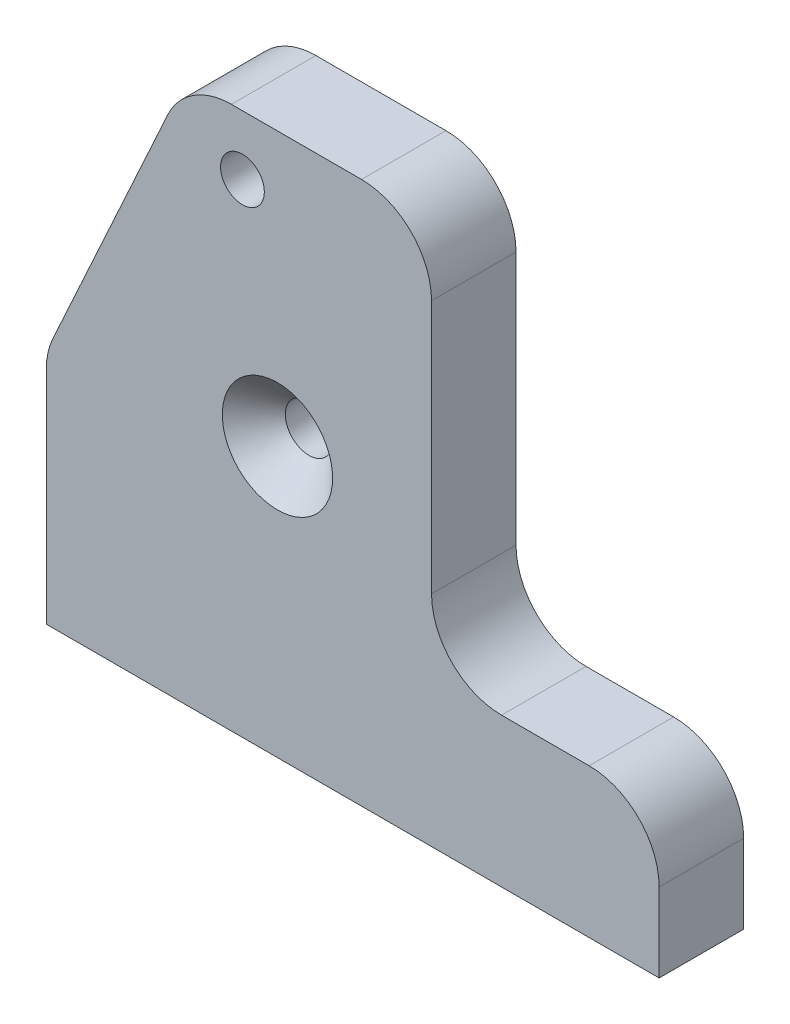
ISO-10303-21;
HEADER;
FILE_DESCRIPTION(('STEP AP214'),'2;1');
FILE_NAME('part.step','',(''),(''),'','','');
FILE_SCHEMA(('AUTOMOTIVE_DESIGN { 1 0 10303 214 1 1 1 1 }'));
ENDSEC;
DATA;
#1=APPLICATION_CONTEXT('core data for automotive mechanical design processes');
#2=APPLICATION_PROTOCOL_DEFINITION('international standard','automotive_design',2000,#1);
#3=PRODUCT_CONTEXT('',#1,'mechanical');
#4=PRODUCT('Part','Part','',(#3));
#5=PRODUCT_RELATED_PRODUCT_CATEGORY('part','',(#4));
#6=PRODUCT_DEFINITION_FORMATION('','',#4);
#7=PRODUCT_DEFINITION_CONTEXT('part definition',#1,'design');
#8=PRODUCT_DEFINITION('design','',#6,#7);
#9=PRODUCT_DEFINITION_SHAPE('','',#8);
#10=(LENGTH_UNIT() NAMED_UNIT(*) SI_UNIT(.MILLI.,.METRE.));
#11=(NAMED_UNIT(*) PLANE_ANGLE_UNIT() SI_UNIT($,.RADIAN.));
#12=(NAMED_UNIT(*) SI_UNIT($,.STERADIAN.) SOLID_ANGLE_UNIT());
#13=UNCERTAINTY_MEASURE_WITH_UNIT(LENGTH_MEASURE(1.E-05),#10,'distance_accuracy_value','');
#14=(GEOMETRIC_REPRESENTATION_CONTEXT(3) GLOBAL_UNCERTAINTY_ASSIGNED_CONTEXT((#13)) GLOBAL_UNIT_ASSIGNED_CONTEXT((#10,
#11,#12)) REPRESENTATION_CONTEXT('',''));
#15=CARTESIAN_POINT('',(0.,0.,0.));
#16=DIRECTION('',(0.,0.,1.));
#17=DIRECTION('',(1.,0.,0.));
#18=AXIS2_PLACEMENT_3D('',#15,#16,#17);
#19=CARTESIAN_POINT('',(0.,31.,4.826));
#20=DIRECTION('',(0.,1.,0.));
#21=DIRECTION('',(-1.,0.,0.));
#22=AXIS2_PLACEMENT_3D('',#19,#20,#21);
#23=PLANE('',#22);
#24=DIRECTION('',(1.,0.,0.));
#25=VECTOR('',#24,1.);
#26=CARTESIAN_POINT('',(0.,31.,0.));
#27=LINE('',#26,#25);
#28=CARTESIAN_POINT('',(10.5695728925472,31.,0.));
#29=VERTEX_POINT('',#28);
#30=CARTESIAN_POINT('',(18.,31.,0.));
#31=VERTEX_POINT('',#30);
#32=EDGE_CURVE('E180',#29,#31,#27,.T.);
#33=ORIENTED_EDGE('',*,*,#32,.F.);
#34=DIRECTION('',(0.,0.,-1.));
#35=VECTOR('',#34,1.);
#36=CARTESIAN_POINT('',(10.5695728925472,31.,4.826));
#37=LINE('',#36,#35);
#38=CARTESIAN_POINT('',(10.5695728925472,31.,4.826));
#39=VERTEX_POINT('',#38);
#40=EDGE_CURVE('E279',#29,#39,#37,.F.);
#41=ORIENTED_EDGE('',*,*,#40,.T.);
#42=DIRECTION('',(1.,0.,0.));
#43=VECTOR('',#42,1.);
#44=CARTESIAN_POINT('',(0.,31.,4.826));
#45=LINE('',#44,#43);
#46=CARTESIAN_POINT('',(18.,31.,4.826));
#47=VERTEX_POINT('',#46);
#48=EDGE_CURVE('E181',#39,#47,#45,.T.);
#49=ORIENTED_EDGE('',*,*,#48,.T.);
#50=DIRECTION('',(0.,0.,-1.));
#51=VECTOR('',#50,1.);
#52=CARTESIAN_POINT('',(18.,31.,4.826));
#53=LINE('',#52,#51);
#54=EDGE_CURVE('E275',#47,#31,#53,.T.);
#55=ORIENTED_EDGE('',*,*,#54,.T.);
#56=EDGE_LOOP('',(#33,#41,#49,#55));
#57=FACE_BOUND('',#56,.T.);
#58=ADVANCED_FACE('F51',(#57),#23,.T.);
#59=CARTESIAN_POINT('',(-5.10465901417961,2.33355840648211,4.826));
#60=DIRECTION('',(0.9094744755858,-0.415759760267795,0.));
#61=DIRECTION('',(0.415759760267795,0.9094744755858,0.));
#62=AXIS2_PLACEMENT_3D('',#59,#60,#61);
#63=PLANE('',#62);
#64=DIRECTION('',(-0.415759760267795,-0.9094744755858,0.));
#65=VECTOR('',#64,1.);
#66=CARTESIAN_POINT('',(-5.10465901417961,2.33355840648211,0.));
#67=LINE('',#66,#65);
#68=CARTESIAN_POINT('',(6.93167499020397,28.6630390410712,0.));
#69=VERTEX_POINT('',#68);
#70=CARTESIAN_POINT('',(0.3621020976568,14.2920983386242,0.));
#71=VERTEX_POINT('',#70);
#72=EDGE_CURVE('E212',#69,#71,#67,.T.);
#73=ORIENTED_EDGE('',*,*,#72,.T.);
#74=DIRECTION('',(0.,0.,-1.));
#75=VECTOR('',#74,1.);
#76=CARTESIAN_POINT('',(0.362102097656799,14.2920983386242,4.826));
#77=LINE('',#76,#75);
#78=CARTESIAN_POINT('',(0.3621020976568,14.2920983386242,4.826));
#79=VERTEX_POINT('',#78);
#80=EDGE_CURVE('E260',#71,#79,#77,.F.);
#81=ORIENTED_EDGE('',*,*,#80,.T.);
#82=DIRECTION('',(-0.415759760267795,-0.9094744755858,0.));
#83=VECTOR('',#82,1.);
#84=CARTESIAN_POINT('',(-5.10465901417961,2.33355840648211,4.826));
#85=LINE('',#84,#83);
#86=CARTESIAN_POINT('',(6.93167499020397,28.6630390410712,4.826));
#87=VERTEX_POINT('',#86);
#88=EDGE_CURVE('E185',#87,#79,#85,.T.);
#89=ORIENTED_EDGE('',*,*,#88,.F.);
#90=DIRECTION('',(0.,0.,-1.));
#91=VECTOR('',#90,1.);
#92=CARTESIAN_POINT('',(6.93167499020397,28.6630390410712,0.));
#93=LINE('',#92,#91);
#94=EDGE_CURVE('E256',#87,#69,#93,.T.);
#95=ORIENTED_EDGE('',*,*,#94,.T.);
#96=EDGE_LOOP('',(#73,#81,#89,#95));
#97=FACE_BOUND('',#96,.T.);
#98=ADVANCED_FACE('F324',(#97),#63,.F.);
#99=CARTESIAN_POINT('',(0.,0.,4.826));
#100=DIRECTION('',(-1.,0.,0.));
#101=DIRECTION('',(0.,0.,1.));
#102=AXIS2_PLACEMENT_3D('',#99,#100,#101);
#103=PLANE('',#102);
#104=DIRECTION('',(0.,1.,0.));
#105=VECTOR('',#104,1.);
#106=CARTESIAN_POINT('',(0.,0.,4.826));
#107=LINE('',#106,#105);
#108=CARTESIAN_POINT('',(0.,0.,4.826));
#109=VERTEX_POINT('',#108);
#110=CARTESIAN_POINT('',(0.,12.6290592975531,4.826));
#111=VERTEX_POINT('',#110);
#112=EDGE_CURVE('E190',#109,#111,#107,.T.);
#113=ORIENTED_EDGE('',*,*,#112,.T.);
#114=DIRECTION('',(0.,0.,-1.));
#115=VECTOR('',#114,1.);
#116=CARTESIAN_POINT('',(0.,12.6290592975531,0.));
#117=LINE('',#116,#115);
#118=CARTESIAN_POINT('',(0.,12.6290592975531,0.));
#119=VERTEX_POINT('',#118);
#120=EDGE_CURVE('E240',#111,#119,#117,.T.);
#121=ORIENTED_EDGE('',*,*,#120,.T.);
#122=DIRECTION('',(0.,1.,0.));
#123=VECTOR('',#122,1.);
#124=CARTESIAN_POINT('',(0.,0.,0.));
#125=LINE('',#124,#123);
#126=CARTESIAN_POINT('',(0.,0.,0.));
#127=VERTEX_POINT('',#126);
#128=EDGE_CURVE('E216',#127,#119,#125,.T.);
#129=ORIENTED_EDGE('',*,*,#128,.F.);
#130=DIRECTION('',(0.,0.,-1.));
#131=VECTOR('',#130,1.);
#132=CARTESIAN_POINT('',(0.,0.,4.826));
#133=LINE('',#132,#131);
#134=EDGE_CURVE('E237',#109,#127,#133,.T.);
#135=ORIENTED_EDGE('',*,*,#134,.F.);
#136=EDGE_LOOP('',(#113,#121,#129,#135));
#137=FACE_BOUND('',#136,.T.);
#138=ADVANCED_FACE('F333',(#137),#103,.T.);
#139=CARTESIAN_POINT('',(0.,0.,4.826));
#140=DIRECTION('',(0.,-1.,0.));
#141=DIRECTION('',(1.,0.,0.));
#142=AXIS2_PLACEMENT_3D('',#139,#140,#141);
#143=PLANE('',#142);
#144=CARTESIAN_POINT('',(16.73,0.,2.413));
#145=DIRECTION('',(0.,-1.,0.));
#146=DIRECTION('',(0.,0.,-1.));
#147=AXIS2_PLACEMENT_3D('',#144,#145,#146);
#148=CIRCLE('',#147,1.24999999999999);
#149=CARTESIAN_POINT('',(16.73,0.,1.16300000000001));
#150=VERTEX_POINT('',#149);
#151=EDGE_CURVE('E157',#150,#150,#148,.T.);
#152=ORIENTED_EDGE('',*,*,#151,.F.);
#153=EDGE_LOOP('',(#152));
#154=FACE_BOUND('',#153,.T.);
#155=CARTESIAN_POINT('',(28.73,0.,2.413));
#156=DIRECTION('',(0.,-1.,0.));
#157=DIRECTION('',(0.,0.,-1.));
#158=AXIS2_PLACEMENT_3D('',#155,#156,#157);
#159=CIRCLE('',#158,1.24999999999999);
#160=CARTESIAN_POINT('',(28.73,0.,1.16300000000001));
#161=VERTEX_POINT('',#160);
#162=EDGE_CURVE('E156',#161,#161,#159,.T.);
#163=ORIENTED_EDGE('',*,*,#162,.F.);
#164=EDGE_LOOP('',(#163));
#165=FACE_BOUND('',#164,.T.);
#166=DIRECTION('',(-1.,0.,0.));
#167=VECTOR('',#166,1.);
#168=CARTESIAN_POINT('',(0.,0.,0.));
#169=LINE('',#168,#167);
#170=CARTESIAN_POINT('',(35.,0.,0.));
#171=VERTEX_POINT('',#170);
#172=EDGE_CURVE('E220',#171,#127,#169,.T.);
#173=ORIENTED_EDGE('',*,*,#172,.F.);
#174=DIRECTION('',(0.,0.,-1.));
#175=VECTOR('',#174,1.);
#176=CARTESIAN_POINT('',(35.,0.,4.826));
#177=LINE('',#176,#175);
#178=CARTESIAN_POINT('',(35.,0.,4.826));
#179=VERTEX_POINT('',#178);
#180=EDGE_CURVE('E208',#179,#171,#177,.T.);
#181=ORIENTED_EDGE('',*,*,#180,.F.);
#182=DIRECTION('',(-1.,0.,0.));
#183=VECTOR('',#182,1.);
#184=CARTESIAN_POINT('',(0.,0.,4.826));
#185=LINE('',#184,#183);
#186=EDGE_CURVE('E194',#179,#109,#185,.T.);
#187=ORIENTED_EDGE('',*,*,#186,.T.);
#188=ORIENTED_EDGE('',*,*,#134,.T.);
#189=EDGE_LOOP('',(#173,#181,#187,#188));
#190=FACE_BOUND('',#189,.T.);
#191=ADVANCED_FACE('F338',(#154,#165,#190),#143,.T.);
#192=CARTESIAN_POINT('',(35.,0.,4.826));
#193=DIRECTION('',(1.,0.,0.));
#194=DIRECTION('',(0.,0.,-1.));
#195=AXIS2_PLACEMENT_3D('',#192,#193,#194);
#196=PLANE('',#195);
#197=DIRECTION('',(0.,-1.,0.));
#198=VECTOR('',#197,1.);
#199=CARTESIAN_POINT('',(35.,0.,0.));
#200=LINE('',#199,#198);
#201=CARTESIAN_POINT('',(35.,4.5,0.));
#202=VERTEX_POINT('',#201);
#203=EDGE_CURVE('E224',#202,#171,#200,.T.);
#204=ORIENTED_EDGE('',*,*,#203,.F.);
#205=DIRECTION('',(0.,0.,-1.));
#206=VECTOR('',#205,1.);
#207=CARTESIAN_POINT('',(35.,4.5,4.826));
#208=LINE('',#207,#206);
#209=CARTESIAN_POINT('',(35.,4.5,4.826));
#210=VERTEX_POINT('',#209);
#211=EDGE_CURVE('E289',#202,#210,#208,.F.);
#212=ORIENTED_EDGE('',*,*,#211,.T.);
#213=DIRECTION('',(0.,-1.,0.));
#214=VECTOR('',#213,1.);
#215=CARTESIAN_POINT('',(35.,0.,4.826));
#216=LINE('',#215,#214);
#217=EDGE_CURVE('E198',#210,#179,#216,.T.);
#218=ORIENTED_EDGE('',*,*,#217,.T.);
#219=ORIENTED_EDGE('',*,*,#180,.T.);
#220=EDGE_LOOP('',(#204,#212,#218,#219));
#221=FACE_BOUND('',#220,.T.);
#222=ADVANCED_FACE('F346',(#221),#196,.T.);
#223=CARTESIAN_POINT('',(0.,8.5,4.826));
#224=DIRECTION('',(0.,1.,0.));
#225=DIRECTION('',(0.,0.,1.));
#226=AXIS2_PLACEMENT_3D('',#223,#224,#225);
#227=PLANE('',#226);
#228=DIRECTION('',(1.,0.,0.));
#229=VECTOR('',#228,1.);
#230=CARTESIAN_POINT('',(0.,8.5,4.826));
#231=LINE('',#230,#229);
#232=CARTESIAN_POINT('',(26.,8.5,4.826));
#233=VERTEX_POINT('',#232);
#234=CARTESIAN_POINT('',(31.,8.5,4.826));
#235=VERTEX_POINT('',#234);
#236=EDGE_CURVE('E201',#233,#235,#231,.T.);
#237=ORIENTED_EDGE('',*,*,#236,.T.);
#238=DIRECTION('',(0.,0.,-1.));
#239=VECTOR('',#238,1.);
#240=CARTESIAN_POINT('',(31.,8.5,4.826));
#241=LINE('',#240,#239);
#242=CARTESIAN_POINT('',(31.,8.5,0.));
#243=VERTEX_POINT('',#242);
#244=EDGE_CURVE('E285',#235,#243,#241,.T.);
#245=ORIENTED_EDGE('',*,*,#244,.T.);
#246=DIRECTION('',(1.,0.,0.));
#247=VECTOR('',#246,1.);
#248=CARTESIAN_POINT('',(0.,8.5,0.));
#249=LINE('',#248,#247);
#250=CARTESIAN_POINT('',(26.,8.5,0.));
#251=VERTEX_POINT('',#250);
#252=EDGE_CURVE('E227',#251,#243,#249,.T.);
#253=ORIENTED_EDGE('',*,*,#252,.F.);
#254=DIRECTION('',(0.,0.,-1.));
#255=VECTOR('',#254,1.);
#256=CARTESIAN_POINT('',(26.,8.5,4.826));
#257=LINE('',#256,#255);
#258=EDGE_CURVE('E282',#251,#233,#257,.F.);
#259=ORIENTED_EDGE('',*,*,#258,.T.);
#260=EDGE_LOOP('',(#237,#245,#253,#259));
#261=FACE_BOUND('',#260,.T.);
#262=ADVANCED_FACE('F305',(#261),#227,.T.);
#263=CARTESIAN_POINT('',(22.,0.,4.826));
#264=DIRECTION('',(1.,0.,0.));
#265=DIRECTION('',(0.,1.,0.));
#266=AXIS2_PLACEMENT_3D('',#263,#264,#265);
#267=PLANE('',#266);
#268=DIRECTION('',(0.,-1.,0.));
#269=VECTOR('',#268,1.);
#270=CARTESIAN_POINT('',(22.,0.,4.826));
#271=LINE('',#270,#269);
#272=CARTESIAN_POINT('',(22.,27.,4.826));
#273=VERTEX_POINT('',#272);
#274=CARTESIAN_POINT('',(22.,12.5,4.826));
#275=VERTEX_POINT('',#274);
#276=EDGE_CURVE('E205',#273,#275,#271,.T.);
#277=ORIENTED_EDGE('',*,*,#276,.T.);
#278=DIRECTION('',(0.,0.,-1.));
#279=VECTOR('',#278,1.);
#280=CARTESIAN_POINT('',(22.,12.5,0.));
#281=LINE('',#280,#279);
#282=CARTESIAN_POINT('',(22.,12.5,0.));
#283=VERTEX_POINT('',#282);
#284=EDGE_CURVE('E294',#275,#283,#281,.T.);
#285=ORIENTED_EDGE('',*,*,#284,.T.);
#286=DIRECTION('',(0.,-1.,0.));
#287=VECTOR('',#286,1.);
#288=CARTESIAN_POINT('',(22.,0.,0.));
#289=LINE('',#288,#287);
#290=CARTESIAN_POINT('',(22.,27.,0.));
#291=VERTEX_POINT('',#290);
#292=EDGE_CURVE('E186',#291,#283,#289,.T.);
#293=ORIENTED_EDGE('',*,*,#292,.F.);
#294=DIRECTION('',(0.,0.,-1.));
#295=VECTOR('',#294,1.);
#296=CARTESIAN_POINT('',(22.,27.,4.826));
#297=LINE('',#296,#295);
#298=EDGE_CURVE('E72',#291,#273,#297,.F.);
#299=ORIENTED_EDGE('',*,*,#298,.T.);
#300=EDGE_LOOP('',(#277,#285,#293,#299));
#301=FACE_BOUND('',#300,.T.);
#302=ADVANCED_FACE('F308',(#301),#267,.T.);
#303=CARTESIAN_POINT('',(0.,0.,4.826));
#304=DIRECTION('',(0.,0.,1.));
#305=DIRECTION('',(1.,0.,0.));
#306=AXIS2_PLACEMENT_3D('',#303,#304,#305);
#307=PLANE('',#306);
#308=CARTESIAN_POINT('',(13.2,15.4,4.826));
#309=DIRECTION('',(0.,0.,1.));
#310=DIRECTION('',(1.,0.,0.));
#311=AXIS2_PLACEMENT_3D('',#308,#309,#310);
#312=CIRCLE('',#311,3.15);
#313=CARTESIAN_POINT('',(16.35,15.4,4.826));
#314=VERTEX_POINT('',#313);
#315=EDGE_CURVE('E618',#314,#314,#312,.T.);
#316=ORIENTED_EDGE('',*,*,#315,.F.);
#317=EDGE_LOOP('',(#316));
#318=FACE_BOUND('',#317,.T.);
#319=CARTESIAN_POINT('',(11.2,27.6,4.826));
#320=DIRECTION('',(0.,0.,1.));
#321=DIRECTION('',(1.,0.,0.));
#322=AXIS2_PLACEMENT_3D('',#319,#320,#321);
#323=CIRCLE('',#322,1.24999999999999);
#324=CARTESIAN_POINT('',(12.45,27.6,4.826));
#325=VERTEX_POINT('',#324);
#326=EDGE_CURVE('E172',#325,#325,#323,.T.);
#327=ORIENTED_EDGE('',*,*,#326,.F.);
#328=EDGE_LOOP('',(#327));
#329=FACE_BOUND('',#328,.T.);
#330=ORIENTED_EDGE('',*,*,#88,.T.);
#331=CARTESIAN_POINT('',(4.,12.6290592975531,4.826));
#332=DIRECTION('',(0.,0.,1.));
#333=DIRECTION('',(1.,0.,0.));
#334=AXIS2_PLACEMENT_3D('',#331,#332,#333);
#335=CIRCLE('',#334,4.);
#336=EDGE_CURVE('E272',#79,#111,#335,.T.);
#337=ORIENTED_EDGE('',*,*,#336,.T.);
#338=ORIENTED_EDGE('',*,*,#112,.F.);
#339=ORIENTED_EDGE('',*,*,#186,.F.);
#340=ORIENTED_EDGE('',*,*,#217,.F.);
#341=CARTESIAN_POINT('',(31.,4.5,4.826));
#342=DIRECTION('',(0.,0.,1.));
#343=DIRECTION('',(1.,0.,0.));
#344=AXIS2_PLACEMENT_3D('',#341,#342,#343);
#345=CIRCLE('',#344,4.);
#346=EDGE_CURVE('E266',#210,#235,#345,.T.);
#347=ORIENTED_EDGE('',*,*,#346,.T.);
#348=ORIENTED_EDGE('',*,*,#236,.F.);
#349=CARTESIAN_POINT('',(26.,12.5,4.826));
#350=DIRECTION('',(0.,0.,1.));
#351=DIRECTION('',(1.,0.,0.));
#352=AXIS2_PLACEMENT_3D('',#349,#350,#351);
#353=CIRCLE('',#352,4.);
#354=EDGE_CURVE('E11',#233,#275,#353,.F.);
#355=ORIENTED_EDGE('',*,*,#354,.T.);
#356=ORIENTED_EDGE('',*,*,#276,.F.);
#357=CARTESIAN_POINT('',(18.,27.,4.826));
#358=DIRECTION('',(0.,0.,1.));
#359=DIRECTION('',(1.,0.,0.));
#360=AXIS2_PLACEMENT_3D('',#357,#358,#359);
#361=CIRCLE('',#360,4.);
#362=EDGE_CURVE('E263',#273,#47,#361,.T.);
#363=ORIENTED_EDGE('',*,*,#362,.T.);
#364=ORIENTED_EDGE('',*,*,#48,.F.);
#365=CARTESIAN_POINT('',(10.5695728925472,27.,4.826));
#366=DIRECTION('',(0.,0.,1.));
#367=DIRECTION('',(1.,0.,0.));
#368=AXIS2_PLACEMENT_3D('',#365,#366,#367);
#369=CIRCLE('',#368,4.);
#370=EDGE_CURVE('E269',#39,#87,#369,.T.);
#371=ORIENTED_EDGE('',*,*,#370,.T.);
#372=EDGE_LOOP('',(#330,#337,#338,#339,#340,#347,#348,#355,#356,#363,#364,#371));
#373=FACE_BOUND('',#372,.T.);
#374=ADVANCED_FACE('F310',(#318,#329,#373),#307,.T.);
#375=CARTESIAN_POINT('',(0.,0.,0.));
#376=DIRECTION('',(0.,0.,1.));
#377=DIRECTION('',(1.,0.,0.));
#378=AXIS2_PLACEMENT_3D('',#375,#376,#377);
#379=PLANE('',#378);
#380=CARTESIAN_POINT('',(13.2,15.4,0.));
#381=DIRECTION('',(0.,0.,1.));
#382=DIRECTION('',(1.,0.,0.));
#383=AXIS2_PLACEMENT_3D('',#380,#381,#382);
#384=CIRCLE('',#383,1.35);
#385=CARTESIAN_POINT('',(14.55,15.4,0.));
#386=VERTEX_POINT('',#385);
#387=EDGE_CURVE('E165',#386,#386,#384,.T.);
#388=ORIENTED_EDGE('',*,*,#387,.T.);
#389=EDGE_LOOP('',(#388));
#390=FACE_BOUND('',#389,.T.);
#391=CARTESIAN_POINT('',(11.2,27.6,0.));
#392=DIRECTION('',(0.,0.,1.));
#393=DIRECTION('',(1.,0.,0.));
#394=AXIS2_PLACEMENT_3D('',#391,#392,#393);
#395=CIRCLE('',#394,1.25);
#396=CARTESIAN_POINT('',(12.45,27.6,0.));
#397=VERTEX_POINT('',#396);
#398=EDGE_CURVE('E176',#397,#397,#395,.T.);
#399=ORIENTED_EDGE('',*,*,#398,.T.);
#400=EDGE_LOOP('',(#399));
#401=FACE_BOUND('',#400,.T.);
#402=ORIENTED_EDGE('',*,*,#128,.T.);
#403=CARTESIAN_POINT('',(4.,12.6290592975531,0.));
#404=DIRECTION('',(0.,0.,1.));
#405=DIRECTION('',(1.,0.,0.));
#406=AXIS2_PLACEMENT_3D('',#403,#404,#405);
#407=CIRCLE('',#406,4.);
#408=EDGE_CURVE('E253',#119,#71,#407,.F.);
#409=ORIENTED_EDGE('',*,*,#408,.T.);
#410=ORIENTED_EDGE('',*,*,#72,.F.);
#411=CARTESIAN_POINT('',(10.5695728925472,27.,0.));
#412=DIRECTION('',(0.,0.,1.));
#413=DIRECTION('',(1.,0.,0.));
#414=AXIS2_PLACEMENT_3D('',#411,#412,#413);
#415=CIRCLE('',#414,4.);
#416=EDGE_CURVE('E250',#69,#29,#415,.F.);
#417=ORIENTED_EDGE('',*,*,#416,.T.);
#418=ORIENTED_EDGE('',*,*,#32,.T.);
#419=CARTESIAN_POINT('',(18.,27.,0.));
#420=DIRECTION('',(0.,0.,1.));
#421=DIRECTION('',(1.,0.,0.));
#422=AXIS2_PLACEMENT_3D('',#419,#420,#421);
#423=CIRCLE('',#422,4.);
#424=EDGE_CURVE('E244',#31,#291,#423,.F.);
#425=ORIENTED_EDGE('',*,*,#424,.T.);
#426=ORIENTED_EDGE('',*,*,#292,.T.);
#427=CARTESIAN_POINT('',(26.,12.5,0.));
#428=DIRECTION('',(0.,0.,1.));
#429=DIRECTION('',(1.,0.,0.));
#430=AXIS2_PLACEMENT_3D('',#427,#428,#429);
#431=CIRCLE('',#430,4.);
#432=EDGE_CURVE('E60',#283,#251,#431,.T.);
#433=ORIENTED_EDGE('',*,*,#432,.T.);
#434=ORIENTED_EDGE('',*,*,#252,.T.);
#435=CARTESIAN_POINT('',(31.,4.5,0.));
#436=DIRECTION('',(0.,0.,1.));
#437=DIRECTION('',(1.,0.,0.));
#438=AXIS2_PLACEMENT_3D('',#435,#436,#437);
#439=CIRCLE('',#438,4.);
#440=EDGE_CURVE('E247',#243,#202,#439,.F.);
#441=ORIENTED_EDGE('',*,*,#440,.T.);
#442=ORIENTED_EDGE('',*,*,#203,.T.);
#443=ORIENTED_EDGE('',*,*,#172,.T.);
#444=EDGE_LOOP('',(#402,#409,#410,#417,#418,#425,#426,#433,#434,#441,#442,#443));
#445=FACE_BOUND('',#444,.T.);
#446=ADVANCED_FACE('F300',(#390,#401,#445),#379,.F.);
#447=CARTESIAN_POINT('',(11.2,27.6,4.826));
#448=DIRECTION('',(0.,0.,1.));
#449=DIRECTION('',(1.,0.,0.));
#450=AXIS2_PLACEMENT_3D('',#447,#448,#449);
#451=CYLINDRICAL_SURFACE('',#450,1.24999999999999);
#452=ORIENTED_EDGE('',*,*,#398,.F.);
#453=EDGE_LOOP('',(#452));
#454=FACE_BOUND('',#453,.T.);
#455=ORIENTED_EDGE('',*,*,#326,.T.);
#456=EDGE_LOOP('',(#455));
#457=FACE_BOUND('',#456,.T.);
#458=ADVANCED_FACE('F396',(#454,#457),#451,.F.);
#459=CARTESIAN_POINT('',(28.73,5.,2.413));
#460=DIRECTION('',(0.,-1.,0.));
#461=DIRECTION('',(0.,0.,-1.));
#462=AXIS2_PLACEMENT_3D('',#459,#460,#461);
#463=CONICAL_SURFACE('',#462,1.25,1.02974425867665);
#464=CARTESIAN_POINT('',(28.73,5.75107577378445,2.413));
#465=VERTEX_POINT('',#464);
#466=VERTEX_LOOP('',#465);
#467=FACE_BOUND('',#466,.T.);
#468=CARTESIAN_POINT('',(28.73,5.,2.413));
#469=DIRECTION('',(0.,-1.,0.));
#470=DIRECTION('',(0.,0.,-1.));
#471=AXIS2_PLACEMENT_3D('',#468,#469,#470);
#472=CIRCLE('',#471,1.25);
#473=CARTESIAN_POINT('',(28.73,5.,1.163));
#474=VERTEX_POINT('',#473);
#475=EDGE_CURVE('E162',#474,#474,#472,.T.);
#476=ORIENTED_EDGE('',*,*,#475,.T.);
#477=EDGE_LOOP('',(#476));
#478=FACE_BOUND('',#477,.T.);
#479=ADVANCED_FACE('F392',(#467,#478),#463,.F.);
#480=CARTESIAN_POINT('',(28.73,0.,2.413));
#481=DIRECTION('',(0.,-1.,0.));
#482=DIRECTION('',(0.,0.,-1.));
#483=AXIS2_PLACEMENT_3D('',#480,#481,#482);
#484=CYLINDRICAL_SURFACE('',#483,1.24999999999999);
#485=ORIENTED_EDGE('',*,*,#475,.F.);
#486=EDGE_LOOP('',(#485));
#487=FACE_BOUND('',#486,.T.);
#488=ORIENTED_EDGE('',*,*,#162,.T.);
#489=EDGE_LOOP('',(#488));
#490=FACE_BOUND('',#489,.T.);
#491=ADVANCED_FACE('F149',(#487,#490),#484,.F.);
#492=CARTESIAN_POINT('',(16.73,5.,2.413));
#493=DIRECTION('',(0.,-1.,0.));
#494=DIRECTION('',(0.,0.,-1.));
#495=AXIS2_PLACEMENT_3D('',#492,#493,#494);
#496=CONICAL_SURFACE('',#495,1.25,1.02974425867665);
#497=CARTESIAN_POINT('',(16.73,5.75107577378445,2.413));
#498=VERTEX_POINT('',#497);
#499=VERTEX_LOOP('',#498);
#500=FACE_BOUND('',#499,.T.);
#501=CARTESIAN_POINT('',(16.73,5.,2.413));
#502=DIRECTION('',(0.,-1.,0.));
#503=DIRECTION('',(0.,0.,-1.));
#504=AXIS2_PLACEMENT_3D('',#501,#502,#503);
#505=CIRCLE('',#504,1.25);
#506=CARTESIAN_POINT('',(16.73,5.,1.163));
#507=VERTEX_POINT('',#506);
#508=EDGE_CURVE('E153',#507,#507,#505,.T.);
#509=ORIENTED_EDGE('',*,*,#508,.T.);
#510=EDGE_LOOP('',(#509));
#511=FACE_BOUND('',#510,.T.);
#512=ADVANCED_FACE('F145',(#500,#511),#496,.F.);
#513=CARTESIAN_POINT('',(16.73,0.,2.413));
#514=DIRECTION('',(0.,-1.,0.));
#515=DIRECTION('',(0.,0.,-1.));
#516=AXIS2_PLACEMENT_3D('',#513,#514,#515);
#517=CYLINDRICAL_SURFACE('',#516,1.24999999999999);
#518=ORIENTED_EDGE('',*,*,#508,.F.);
#519=EDGE_LOOP('',(#518));
#520=FACE_BOUND('',#519,.T.);
#521=ORIENTED_EDGE('',*,*,#151,.T.);
#522=EDGE_LOOP('',(#521));
#523=FACE_BOUND('',#522,.T.);
#524=ADVANCED_FACE('F148',(#520,#523),#517,.F.);
#525=CARTESIAN_POINT('',(4.,12.6290592975531,4.826));
#526=DIRECTION('',(0.,0.,1.));
#527=DIRECTION('',(1.,0.,0.));
#528=AXIS2_PLACEMENT_3D('',#525,#526,#527);
#529=CYLINDRICAL_SURFACE('',#528,4.);
#530=ORIENTED_EDGE('',*,*,#336,.F.);
#531=ORIENTED_EDGE('',*,*,#80,.F.);
#532=ORIENTED_EDGE('',*,*,#408,.F.);
#533=ORIENTED_EDGE('',*,*,#120,.F.);
#534=EDGE_LOOP('',(#530,#531,#532,#533));
#535=FACE_BOUND('',#534,.T.);
#536=ADVANCED_FACE('F330',(#535),#529,.T.);
#537=CARTESIAN_POINT('',(10.5695728925472,27.,4.826));
#538=DIRECTION('',(0.,0.,1.));
#539=DIRECTION('',(1.,0.,0.));
#540=AXIS2_PLACEMENT_3D('',#537,#538,#539);
#541=CYLINDRICAL_SURFACE('',#540,4.);
#542=ORIENTED_EDGE('',*,*,#370,.F.);
#543=ORIENTED_EDGE('',*,*,#40,.F.);
#544=ORIENTED_EDGE('',*,*,#416,.F.);
#545=ORIENTED_EDGE('',*,*,#94,.F.);
#546=EDGE_LOOP('',(#542,#543,#544,#545));
#547=FACE_BOUND('',#546,.T.);
#548=ADVANCED_FACE('F321',(#547),#541,.T.);
#549=CARTESIAN_POINT('',(31.,4.5,4.826));
#550=DIRECTION('',(0.,0.,-1.));
#551=DIRECTION('',(-1.,0.,0.));
#552=AXIS2_PLACEMENT_3D('',#549,#550,#551);
#553=CYLINDRICAL_SURFACE('',#552,4.);
#554=ORIENTED_EDGE('',*,*,#346,.F.);
#555=ORIENTED_EDGE('',*,*,#211,.F.);
#556=ORIENTED_EDGE('',*,*,#440,.F.);
#557=ORIENTED_EDGE('',*,*,#244,.F.);
#558=EDGE_LOOP('',(#554,#555,#556,#557));
#559=FACE_BOUND('',#558,.T.);
#560=ADVANCED_FACE('F345',(#559),#553,.T.);
#561=CARTESIAN_POINT('',(26.,12.5,4.826));
#562=DIRECTION('',(0.,0.,1.));
#563=DIRECTION('',(1.,0.,0.));
#564=AXIS2_PLACEMENT_3D('',#561,#562,#563);
#565=CYLINDRICAL_SURFACE('',#564,4.);
#566=ORIENTED_EDGE('',*,*,#354,.F.);
#567=ORIENTED_EDGE('',*,*,#258,.F.);
#568=ORIENTED_EDGE('',*,*,#432,.F.);
#569=ORIENTED_EDGE('',*,*,#284,.F.);
#570=EDGE_LOOP('',(#566,#567,#568,#569));
#571=FACE_BOUND('',#570,.T.);
#572=ADVANCED_FACE('F307',(#571),#565,.F.);
#573=CARTESIAN_POINT('',(18.,27.,4.826));
#574=DIRECTION('',(0.,0.,-1.));
#575=DIRECTION('',(-1.,0.,0.));
#576=AXIS2_PLACEMENT_3D('',#573,#574,#575);
#577=CYLINDRICAL_SURFACE('',#576,4.);
#578=ORIENTED_EDGE('',*,*,#362,.F.);
#579=ORIENTED_EDGE('',*,*,#298,.F.);
#580=ORIENTED_EDGE('',*,*,#424,.F.);
#581=ORIENTED_EDGE('',*,*,#54,.F.);
#582=EDGE_LOOP('',(#578,#579,#580,#581));
#583=FACE_BOUND('',#582,.T.);
#584=ADVANCED_FACE('F53',(#583),#577,.T.);
#585=CARTESIAN_POINT('',(13.2,15.4,4.826));
#586=DIRECTION('',(0.,0.,1.));
#587=DIRECTION('',(1.,0.,0.));
#588=AXIS2_PLACEMENT_3D('',#585,#586,#587);
#589=CYLINDRICAL_SURFACE('',#588,1.35);
#590=ORIENTED_EDGE('',*,*,#387,.F.);
#591=EDGE_LOOP('',(#590));
#592=FACE_BOUND('',#591,.T.);
#593=CARTESIAN_POINT('',(13.2,15.4,3.026));
#594=DIRECTION('',(0.,0.,1.));
#595=DIRECTION('',(1.,0.,0.));
#596=AXIS2_PLACEMENT_3D('',#593,#594,#595);
#597=CIRCLE('',#596,1.35);
#598=CARTESIAN_POINT('',(14.55,15.4,3.026));
#599=VERTEX_POINT('',#598);
#600=EDGE_CURVE('E615',#599,#599,#597,.T.);
#601=ORIENTED_EDGE('',*,*,#600,.T.);
#602=EDGE_LOOP('',(#601));
#603=FACE_BOUND('',#602,.T.);
#604=ADVANCED_FACE('F373',(#592,#603),#589,.F.);
#605=CARTESIAN_POINT('',(13.2,15.4,4.826));
#606=DIRECTION('',(0.,0.,1.));
#607=DIRECTION('',(1.,0.,0.));
#608=AXIS2_PLACEMENT_3D('',#605,#606,#607);
#609=CONICAL_SURFACE('',#608,3.15,0.785398163397447);
#610=ORIENTED_EDGE('',*,*,#600,.F.);
#611=EDGE_LOOP('',(#610));
#612=FACE_BOUND('',#611,.T.);
#613=ORIENTED_EDGE('',*,*,#315,.T.);
#614=EDGE_LOOP('',(#613));
#615=FACE_BOUND('',#614,.T.);
#616=ADVANCED_FACE('F377',(#612,#615),#609,.F.);
#617=CLOSED_SHELL('',(#58,#98,#138,#191,#222,#262,#302,#374,#446,#458,#479,#491,#512,#524,#536,
#548,#560,#572,#584,#604,#616));
#618=MANIFOLD_SOLID_BREP('B2',#617);
#619=ADVANCED_BREP_SHAPE_REPRESENTATION('',(#18,#618),#14);
#620=SHAPE_DEFINITION_REPRESENTATION(#9,#619);
ENDSEC;
END-ISO-10303-21;
